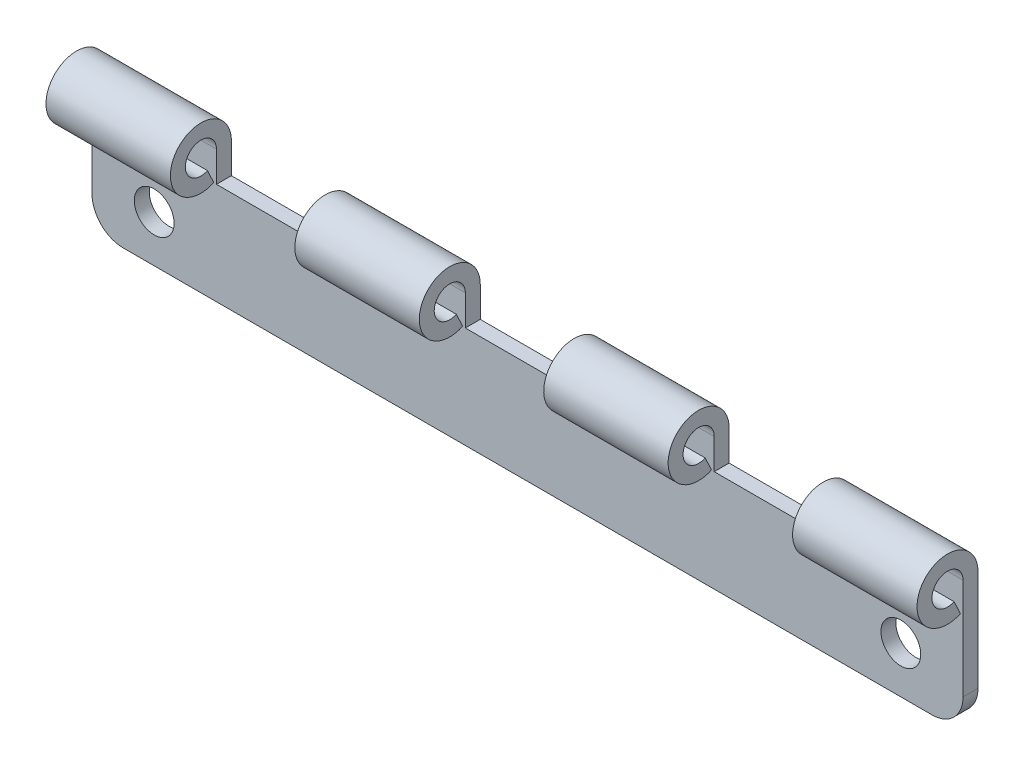
ISO-10303-21;
HEADER;
FILE_DESCRIPTION(('STEP AP214'),'2;1');
FILE_NAME('part.step','',(''),(''),'','','');
FILE_SCHEMA(('AUTOMOTIVE_DESIGN { 1 0 10303 214 1 1 1 1 }'));
ENDSEC;
DATA;
#1=APPLICATION_CONTEXT('core data for automotive mechanical design processes');
#2=APPLICATION_PROTOCOL_DEFINITION('international standard','automotive_design',2000,#1);
#3=PRODUCT_CONTEXT('',#1,'mechanical');
#4=PRODUCT('Part','Part','',(#3));
#5=PRODUCT_RELATED_PRODUCT_CATEGORY('part','',(#4));
#6=PRODUCT_DEFINITION_FORMATION('','',#4);
#7=PRODUCT_DEFINITION_CONTEXT('part definition',#1,'design');
#8=PRODUCT_DEFINITION('design','',#6,#7);
#9=PRODUCT_DEFINITION_SHAPE('','',#8);
#10=(LENGTH_UNIT() NAMED_UNIT(*) SI_UNIT(.MILLI.,.METRE.));
#11=(NAMED_UNIT(*) PLANE_ANGLE_UNIT() SI_UNIT($,.RADIAN.));
#12=(NAMED_UNIT(*) SI_UNIT($,.STERADIAN.) SOLID_ANGLE_UNIT());
#13=UNCERTAINTY_MEASURE_WITH_UNIT(LENGTH_MEASURE(1.E-05),#10,'distance_accuracy_value','');
#14=(GEOMETRIC_REPRESENTATION_CONTEXT(3) GLOBAL_UNCERTAINTY_ASSIGNED_CONTEXT((#13)) GLOBAL_UNIT_ASSIGNED_CONTEXT((#10,
#11,#12)) REPRESENTATION_CONTEXT('',''));
#15=CARTESIAN_POINT('',(0.,0.,0.));
#16=DIRECTION('',(0.,0.,1.));
#17=DIRECTION('',(1.,0.,0.));
#18=AXIS2_PLACEMENT_3D('',#15,#16,#17);
#19=CARTESIAN_POINT('',(304.8,0.,0.));
#20=DIRECTION('',(-1.,0.,0.));
#21=DIRECTION('',(0.,0.,1.));
#22=AXIS2_PLACEMENT_3D('',#19,#20,#21);
#23=CYLINDRICAL_SURFACE('',#22,3.1115);
#24=DIRECTION('',(-1.,0.,0.));
#25=VECTOR('',#24,1.);
#26=CARTESIAN_POINT('',(304.8,-2.81997667936453,-1.31497672140619));
#27=LINE('',#26,#25);
#28=CARTESIAN_POINT('',(-215.9,-2.81997667936453,-1.31497672140619));
#29=VERTEX_POINT('',#28);
#30=CARTESIAN_POINT('',(-228.6,-2.81997667936453,-1.31497672140619));
#31=VERTEX_POINT('',#30);
#32=EDGE_CURVE('E432',#29,#31,#27,.T.);
#33=ORIENTED_EDGE('',*,*,#32,.F.);
#34=CARTESIAN_POINT('',(-215.9,0.,0.));
#35=DIRECTION('',(-1.,0.,0.));
#36=DIRECTION('',(0.,0.,1.));
#37=AXIS2_PLACEMENT_3D('',#34,#35,#36);
#38=CIRCLE('',#37,3.1115);
#39=CARTESIAN_POINT('',(-215.9,0.,-3.1115));
#40=VERTEX_POINT('',#39);
#41=EDGE_CURVE('E402',#29,#40,#38,.T.);
#42=ORIENTED_EDGE('',*,*,#41,.T.);
#43=DIRECTION('',(-1.,0.,0.));
#44=VECTOR('',#43,1.);
#45=CARTESIAN_POINT('',(304.8,0.,-3.1115));
#46=LINE('',#45,#44);
#47=CARTESIAN_POINT('',(-228.6,0.,-3.1115));
#48=VERTEX_POINT('',#47);
#49=EDGE_CURVE('E438',#40,#48,#46,.T.);
#50=ORIENTED_EDGE('',*,*,#49,.T.);
#51=CARTESIAN_POINT('',(-228.6,0.,0.));
#52=DIRECTION('',(1.,0.,0.));
#53=DIRECTION('',(0.,0.,-1.));
#54=AXIS2_PLACEMENT_3D('',#51,#52,#53);
#55=CIRCLE('',#54,3.1115);
#56=EDGE_CURVE('E275',#48,#31,#55,.T.);
#57=ORIENTED_EDGE('',*,*,#56,.T.);
#58=EDGE_LOOP('',(#33,#42,#50,#57));
#59=FACE_BOUND('',#58,.T.);
#60=ADVANCED_FACE('F49',(#59),#23,.T.);
#61=CARTESIAN_POINT('',(-241.3,-2.81997667936453,-1.31497672140619));
#62=VERTEX_POINT('',#61);
#63=CARTESIAN_POINT('',(-254.,-2.81997667936453,-1.31497672140619));
#64=VERTEX_POINT('',#63);
#65=EDGE_CURVE('E599',#62,#64,#27,.T.);
#66=ORIENTED_EDGE('',*,*,#65,.F.);
#67=CARTESIAN_POINT('',(-241.3,0.,0.));
#68=DIRECTION('',(-1.,0.,0.));
#69=DIRECTION('',(0.,0.,1.));
#70=AXIS2_PLACEMENT_3D('',#67,#68,#69);
#71=CIRCLE('',#70,3.1115);
#72=CARTESIAN_POINT('',(-241.3,0.,-3.1115));
#73=VERTEX_POINT('',#72);
#74=EDGE_CURVE('E393',#62,#73,#71,.T.);
#75=ORIENTED_EDGE('',*,*,#74,.T.);
#76=CARTESIAN_POINT('',(-254.,0.,-3.1115));
#77=VERTEX_POINT('',#76);
#78=EDGE_CURVE('E581',#73,#77,#46,.T.);
#79=ORIENTED_EDGE('',*,*,#78,.T.);
#80=CARTESIAN_POINT('',(-254.,0.,0.));
#81=DIRECTION('',(1.,0.,0.));
#82=DIRECTION('',(0.,0.,-1.));
#83=AXIS2_PLACEMENT_3D('',#80,#81,#82);
#84=CIRCLE('',#83,3.1115);
#85=EDGE_CURVE('E362',#77,#64,#84,.T.);
#86=ORIENTED_EDGE('',*,*,#85,.T.);
#87=EDGE_LOOP('',(#66,#75,#79,#86));
#88=FACE_BOUND('',#87,.T.);
#89=ADVANCED_FACE('F528',(#88),#23,.T.);
#90=CARTESIAN_POINT('',(-266.7,-2.81997667936453,-1.31497672140619));
#91=VERTEX_POINT('',#90);
#92=CARTESIAN_POINT('',(-279.4,-2.81997667936453,-1.31497672140619));
#93=VERTEX_POINT('',#92);
#94=EDGE_CURVE('E431',#91,#93,#27,.T.);
#95=ORIENTED_EDGE('',*,*,#94,.F.);
#96=CARTESIAN_POINT('',(-266.7,0.,0.));
#97=DIRECTION('',(-1.,0.,0.));
#98=DIRECTION('',(0.,0.,1.));
#99=AXIS2_PLACEMENT_3D('',#96,#97,#98);
#100=CIRCLE('',#99,3.1115);
#101=CARTESIAN_POINT('',(-266.7,0.,-3.1115));
#102=VERTEX_POINT('',#101);
#103=EDGE_CURVE('E373',#91,#102,#100,.T.);
#104=ORIENTED_EDGE('',*,*,#103,.T.);
#105=CARTESIAN_POINT('',(-279.4,0.,-3.1115));
#106=VERTEX_POINT('',#105);
#107=EDGE_CURVE('E437',#102,#106,#46,.T.);
#108=ORIENTED_EDGE('',*,*,#107,.T.);
#109=CARTESIAN_POINT('',(-279.4,0.,0.));
#110=DIRECTION('',(1.,0.,0.));
#111=DIRECTION('',(0.,0.,-1.));
#112=AXIS2_PLACEMENT_3D('',#109,#110,#111);
#113=CIRCLE('',#112,3.1115);
#114=EDGE_CURVE('E341',#106,#93,#113,.T.);
#115=ORIENTED_EDGE('',*,*,#114,.T.);
#116=EDGE_LOOP('',(#95,#104,#108,#115));
#117=FACE_BOUND('',#116,.T.);
#118=ADVANCED_FACE('F534',(#117),#23,.T.);
#119=CARTESIAN_POINT('',(-292.1,-2.81997667936453,-1.31497672140619));
#120=VERTEX_POINT('',#119);
#121=CARTESIAN_POINT('',(-304.8,-2.81997667936453,-1.31497672140619));
#122=VERTEX_POINT('',#121);
#123=EDGE_CURVE('E428',#120,#122,#27,.T.);
#124=ORIENTED_EDGE('',*,*,#123,.F.);
#125=CARTESIAN_POINT('',(-292.1,0.,0.));
#126=DIRECTION('',(-1.,0.,0.));
#127=DIRECTION('',(0.,0.,1.));
#128=AXIS2_PLACEMENT_3D('',#125,#126,#127);
#129=CIRCLE('',#128,3.1115);
#130=CARTESIAN_POINT('',(-292.1,0.,-3.1115));
#131=VERTEX_POINT('',#130);
#132=EDGE_CURVE('E352',#120,#131,#129,.T.);
#133=ORIENTED_EDGE('',*,*,#132,.T.);
#134=CARTESIAN_POINT('',(-304.8,0.,-3.1115));
#135=VERTEX_POINT('',#134);
#136=EDGE_CURVE('E433',#131,#135,#46,.T.);
#137=ORIENTED_EDGE('',*,*,#136,.T.);
#138=CARTESIAN_POINT('',(-304.8,0.,0.));
#139=DIRECTION('',(1.,0.,0.));
#140=DIRECTION('',(0.,0.,-1.));
#141=AXIS2_PLACEMENT_3D('',#138,#139,#140);
#142=CIRCLE('',#141,3.1115);
#143=EDGE_CURVE('E406',#135,#122,#142,.T.);
#144=ORIENTED_EDGE('',*,*,#143,.T.);
#145=EDGE_LOOP('',(#124,#133,#137,#144));
#146=FACE_BOUND('',#145,.T.);
#147=ADVANCED_FACE('F530',(#146),#23,.T.);
#148=CARTESIAN_POINT('',(304.8,-1.43876361192068,-0.670906490513363));
#149=DIRECTION('',(0.,-0.422618261740701,0.906307787036649));
#150=DIRECTION('',(0.,-0.906307787036649,-0.422618261740701));
#151=AXIS2_PLACEMENT_3D('',#148,#149,#150);
#152=PLANE('',#151);
#153=DIRECTION('',(-1.,0.,0.));
#154=VECTOR('',#153,1.);
#155=CARTESIAN_POINT('',(304.8,-1.43876361192068,-0.670906490513362));
#156=LINE('',#155,#154);
#157=CARTESIAN_POINT('',(-215.9,-1.43876361192068,-0.670906490513362));
#158=VERTEX_POINT('',#157);
#159=CARTESIAN_POINT('',(-228.6,-1.43876361192068,-0.670906490513362));
#160=VERTEX_POINT('',#159);
#161=EDGE_CURVE('E427',#158,#160,#156,.T.);
#162=ORIENTED_EDGE('',*,*,#161,.F.);
#163=DIRECTION('',(0.,-0.906307787036649,-0.422618261740701));
#164=VECTOR('',#163,1.);
#165=CARTESIAN_POINT('',(-215.9,-1.43876361192068,-0.670906490513363));
#166=LINE('',#165,#164);
#167=EDGE_CURVE('E399',#158,#29,#166,.T.);
#168=ORIENTED_EDGE('',*,*,#167,.T.);
#169=ORIENTED_EDGE('',*,*,#32,.T.);
#170=DIRECTION('',(0.,0.906307787036649,0.422618261740701));
#171=VECTOR('',#170,1.);
#172=CARTESIAN_POINT('',(-228.6,-1.43876361192068,-0.670906490513363));
#173=LINE('',#172,#171);
#174=EDGE_CURVE('E380',#31,#160,#173,.T.);
#175=ORIENTED_EDGE('',*,*,#174,.T.);
#176=EDGE_LOOP('',(#162,#168,#169,#175));
#177=FACE_BOUND('',#176,.T.);
#178=ADVANCED_FACE('F539',(#177),#152,.F.);
#179=CARTESIAN_POINT('',(-241.3,-1.43876361192068,-0.670906490513362));
#180=VERTEX_POINT('',#179);
#181=CARTESIAN_POINT('',(-254.,-1.43876361192068,-0.670906490513362));
#182=VERTEX_POINT('',#181);
#183=EDGE_CURVE('E623',#180,#182,#156,.T.);
#184=ORIENTED_EDGE('',*,*,#183,.F.);
#185=DIRECTION('',(0.,-0.906307787036649,-0.422618261740701));
#186=VECTOR('',#185,1.);
#187=CARTESIAN_POINT('',(-241.3,-1.43876361192068,-0.670906490513363));
#188=LINE('',#187,#186);
#189=EDGE_CURVE('E389',#180,#62,#188,.T.);
#190=ORIENTED_EDGE('',*,*,#189,.T.);
#191=ORIENTED_EDGE('',*,*,#65,.T.);
#192=DIRECTION('',(0.,0.906307787036649,0.422618261740701));
#193=VECTOR('',#192,1.);
#194=CARTESIAN_POINT('',(-254.,-1.43876361192068,-0.670906490513363));
#195=LINE('',#194,#193);
#196=EDGE_CURVE('E359',#64,#182,#195,.T.);
#197=ORIENTED_EDGE('',*,*,#196,.T.);
#198=EDGE_LOOP('',(#184,#190,#191,#197));
#199=FACE_BOUND('',#198,.T.);
#200=ADVANCED_FACE('F545',(#199),#152,.F.);
#201=CARTESIAN_POINT('',(-266.7,-1.43876361192068,-0.670906490513362));
#202=VERTEX_POINT('',#201);
#203=CARTESIAN_POINT('',(-279.4,-1.43876361192068,-0.670906490513362));
#204=VERTEX_POINT('',#203);
#205=EDGE_CURVE('E426',#202,#204,#156,.T.);
#206=ORIENTED_EDGE('',*,*,#205,.F.);
#207=DIRECTION('',(0.,-0.906307787036649,-0.422618261740701));
#208=VECTOR('',#207,1.);
#209=CARTESIAN_POINT('',(-266.7,-1.43876361192068,-0.670906490513363));
#210=LINE('',#209,#208);
#211=EDGE_CURVE('E369',#202,#91,#210,.T.);
#212=ORIENTED_EDGE('',*,*,#211,.T.);
#213=ORIENTED_EDGE('',*,*,#94,.T.);
#214=DIRECTION('',(0.,0.906307787036649,0.422618261740701));
#215=VECTOR('',#214,1.);
#216=CARTESIAN_POINT('',(-279.4,-1.43876361192068,-0.670906490513363));
#217=LINE('',#216,#215);
#218=EDGE_CURVE('E337',#93,#204,#217,.T.);
#219=ORIENTED_EDGE('',*,*,#218,.T.);
#220=EDGE_LOOP('',(#206,#212,#213,#219));
#221=FACE_BOUND('',#220,.T.);
#222=ADVANCED_FACE('F597',(#221),#152,.F.);
#223=CARTESIAN_POINT('',(-292.1,-1.43876361192068,-0.670906490513362));
#224=VERTEX_POINT('',#223);
#225=CARTESIAN_POINT('',(-304.8,-1.43876361192068,-0.670906490513362));
#226=VERTEX_POINT('',#225);
#227=EDGE_CURVE('E423',#224,#226,#156,.T.);
#228=ORIENTED_EDGE('',*,*,#227,.F.);
#229=DIRECTION('',(0.,-0.906307787036649,-0.422618261740701));
#230=VECTOR('',#229,1.);
#231=CARTESIAN_POINT('',(-292.1,-1.43876361192068,-0.670906490513363));
#232=LINE('',#231,#230);
#233=EDGE_CURVE('E348',#224,#120,#232,.T.);
#234=ORIENTED_EDGE('',*,*,#233,.T.);
#235=ORIENTED_EDGE('',*,*,#123,.T.);
#236=DIRECTION('',(0.,0.906307787036649,0.422618261740701));
#237=VECTOR('',#236,1.);
#238=CARTESIAN_POINT('',(-304.8,-1.43876361192068,-0.670906490513363));
#239=LINE('',#238,#237);
#240=EDGE_CURVE('E410',#122,#226,#239,.T.);
#241=ORIENTED_EDGE('',*,*,#240,.T.);
#242=EDGE_LOOP('',(#228,#234,#235,#241));
#243=FACE_BOUND('',#242,.T.);
#244=ADVANCED_FACE('F547',(#243),#152,.F.);
#245=CARTESIAN_POINT('',(304.8,0.,0.));
#246=DIRECTION('',(-1.,0.,0.));
#247=DIRECTION('',(0.,0.,1.));
#248=AXIS2_PLACEMENT_3D('',#245,#246,#247);
#249=CYLINDRICAL_SURFACE('',#248,1.5875);
#250=DIRECTION('',(-1.,0.,0.));
#251=VECTOR('',#250,1.);
#252=CARTESIAN_POINT('',(304.8,0.,-1.5875));
#253=LINE('',#252,#251);
#254=CARTESIAN_POINT('',(-215.9,0.,-1.5875));
#255=VERTEX_POINT('',#254);
#256=CARTESIAN_POINT('',(-228.6,0.,-1.5875));
#257=VERTEX_POINT('',#256);
#258=EDGE_CURVE('E422',#255,#257,#253,.T.);
#259=ORIENTED_EDGE('',*,*,#258,.F.);
#260=CARTESIAN_POINT('',(-215.9,0.,0.));
#261=DIRECTION('',(-1.,0.,0.));
#262=DIRECTION('',(0.,0.,1.));
#263=AXIS2_PLACEMENT_3D('',#260,#261,#262);
#264=CIRCLE('',#263,1.5875);
#265=EDGE_CURVE('E396',#255,#158,#264,.F.);
#266=ORIENTED_EDGE('',*,*,#265,.T.);
#267=ORIENTED_EDGE('',*,*,#161,.T.);
#268=CARTESIAN_POINT('',(-228.6,0.,0.));
#269=DIRECTION('',(1.,0.,0.));
#270=DIRECTION('',(0.,0.,-1.));
#271=AXIS2_PLACEMENT_3D('',#268,#269,#270);
#272=CIRCLE('',#271,1.5875);
#273=EDGE_CURVE('E376',#160,#257,#272,.F.);
#274=ORIENTED_EDGE('',*,*,#273,.T.);
#275=EDGE_LOOP('',(#259,#266,#267,#274));
#276=FACE_BOUND('',#275,.T.);
#277=ADVANCED_FACE('F613',(#276),#249,.F.);
#278=CARTESIAN_POINT('',(-241.3,0.,-1.5875));
#279=VERTEX_POINT('',#278);
#280=CARTESIAN_POINT('',(-254.,0.,-1.5875));
#281=VERTEX_POINT('',#280);
#282=EDGE_CURVE('E615',#279,#281,#253,.T.);
#283=ORIENTED_EDGE('',*,*,#282,.F.);
#284=CARTESIAN_POINT('',(-241.3,0.,0.));
#285=DIRECTION('',(-1.,0.,0.));
#286=DIRECTION('',(0.,0.,1.));
#287=AXIS2_PLACEMENT_3D('',#284,#285,#286);
#288=CIRCLE('',#287,1.5875);
#289=EDGE_CURVE('E385',#279,#180,#288,.F.);
#290=ORIENTED_EDGE('',*,*,#289,.T.);
#291=ORIENTED_EDGE('',*,*,#183,.T.);
#292=CARTESIAN_POINT('',(-254.,0.,0.));
#293=DIRECTION('',(1.,0.,0.));
#294=DIRECTION('',(0.,0.,-1.));
#295=AXIS2_PLACEMENT_3D('',#292,#293,#294);
#296=CIRCLE('',#295,1.5875);
#297=EDGE_CURVE('E355',#182,#281,#296,.F.);
#298=ORIENTED_EDGE('',*,*,#297,.T.);
#299=EDGE_LOOP('',(#283,#290,#291,#298));
#300=FACE_BOUND('',#299,.T.);
#301=ADVANCED_FACE('F628',(#300),#249,.F.);
#302=CARTESIAN_POINT('',(-266.7,0.,-1.5875));
#303=VERTEX_POINT('',#302);
#304=CARTESIAN_POINT('',(-279.4,0.,-1.5875));
#305=VERTEX_POINT('',#304);
#306=EDGE_CURVE('E421',#303,#305,#253,.T.);
#307=ORIENTED_EDGE('',*,*,#306,.F.);
#308=CARTESIAN_POINT('',(-266.7,0.,0.));
#309=DIRECTION('',(-1.,0.,0.));
#310=DIRECTION('',(0.,0.,1.));
#311=AXIS2_PLACEMENT_3D('',#308,#309,#310);
#312=CIRCLE('',#311,1.5875);
#313=EDGE_CURVE('E365',#303,#202,#312,.F.);
#314=ORIENTED_EDGE('',*,*,#313,.T.);
#315=ORIENTED_EDGE('',*,*,#205,.T.);
#316=CARTESIAN_POINT('',(-279.4,0.,0.));
#317=DIRECTION('',(1.,0.,0.));
#318=DIRECTION('',(0.,0.,-1.));
#319=AXIS2_PLACEMENT_3D('',#316,#317,#318);
#320=CIRCLE('',#319,1.5875);
#321=EDGE_CURVE('E333',#204,#305,#320,.F.);
#322=ORIENTED_EDGE('',*,*,#321,.T.);
#323=EDGE_LOOP('',(#307,#314,#315,#322));
#324=FACE_BOUND('',#323,.T.);
#325=ADVANCED_FACE('F622',(#324),#249,.F.);
#326=CARTESIAN_POINT('',(-292.1,0.,-1.5875));
#327=VERTEX_POINT('',#326);
#328=CARTESIAN_POINT('',(-304.8,0.,-1.5875));
#329=VERTEX_POINT('',#328);
#330=EDGE_CURVE('E418',#327,#329,#253,.T.);
#331=ORIENTED_EDGE('',*,*,#330,.F.);
#332=CARTESIAN_POINT('',(-292.1,0.,0.));
#333=DIRECTION('',(-1.,0.,0.));
#334=DIRECTION('',(0.,0.,1.));
#335=AXIS2_PLACEMENT_3D('',#332,#333,#334);
#336=CIRCLE('',#335,1.5875);
#337=EDGE_CURVE('E344',#327,#224,#336,.F.);
#338=ORIENTED_EDGE('',*,*,#337,.T.);
#339=ORIENTED_EDGE('',*,*,#227,.T.);
#340=CARTESIAN_POINT('',(-304.8,0.,0.));
#341=DIRECTION('',(-1.,0.,0.));
#342=DIRECTION('',(0.,0.,-1.));
#343=AXIS2_PLACEMENT_3D('',#340,#341,#342);
#344=CIRCLE('',#343,1.5875);
#345=EDGE_CURVE('E413',#226,#329,#344,.T.);
#346=ORIENTED_EDGE('',*,*,#345,.T.);
#347=EDGE_LOOP('',(#331,#338,#339,#346));
#348=FACE_BOUND('',#347,.T.);
#349=ADVANCED_FACE('F523',(#348),#249,.F.);
#350=CARTESIAN_POINT('',(304.8,-13.49375,-3.1115));
#351=DIRECTION('',(0.,1.,0.));
#352=DIRECTION('',(0.,0.,1.));
#353=AXIS2_PLACEMENT_3D('',#350,#351,#352);
#354=PLANE('',#353);
#355=DIRECTION('',(-1.,0.,0.));
#356=VECTOR('',#355,1.);
#357=CARTESIAN_POINT('',(304.8,-13.49375,-1.5875));
#358=LINE('',#357,#356);
#359=CARTESIAN_POINT('',(-219.075,-13.49375,-1.5875));
#360=VERTEX_POINT('',#359);
#361=CARTESIAN_POINT('',(-301.625,-13.49375,-1.5875));
#362=VERTEX_POINT('',#361);
#363=EDGE_CURVE('E442',#360,#362,#358,.T.);
#364=ORIENTED_EDGE('',*,*,#363,.T.);
#365=DIRECTION('',(0.,0.,-1.));
#366=VECTOR('',#365,1.);
#367=CARTESIAN_POINT('',(-301.625,-13.49375,-3.1115));
#368=LINE('',#367,#366);
#369=CARTESIAN_POINT('',(-301.625,-13.49375,-3.1115));
#370=VERTEX_POINT('',#369);
#371=EDGE_CURVE('E484',#362,#370,#368,.T.);
#372=ORIENTED_EDGE('',*,*,#371,.T.);
#373=DIRECTION('',(-1.,0.,0.));
#374=VECTOR('',#373,1.);
#375=CARTESIAN_POINT('',(304.8,-13.49375,-3.1115));
#376=LINE('',#375,#374);
#377=CARTESIAN_POINT('',(-219.075,-13.49375,-3.1115));
#378=VERTEX_POINT('',#377);
#379=EDGE_CURVE('E439',#378,#370,#376,.T.);
#380=ORIENTED_EDGE('',*,*,#379,.F.);
#381=DIRECTION('',(0.,0.,1.));
#382=VECTOR('',#381,1.);
#383=CARTESIAN_POINT('',(-219.075,-13.49375,-3.1115));
#384=LINE('',#383,#382);
#385=EDGE_CURVE('E481',#378,#360,#384,.T.);
#386=ORIENTED_EDGE('',*,*,#385,.T.);
#387=EDGE_LOOP('',(#364,#372,#380,#386));
#388=FACE_BOUND('',#387,.T.);
#389=ADVANCED_FACE('F512',(#388),#354,.F.);
#390=CARTESIAN_POINT('',(304.8,0.,-3.1115));
#391=DIRECTION('',(0.,0.,1.));
#392=DIRECTION('',(0.,-1.,0.));
#393=AXIS2_PLACEMENT_3D('',#390,#391,#392);
#394=PLANE('',#393);
#395=CARTESIAN_POINT('',(-222.25,-8.73125,-3.1115));
#396=DIRECTION('',(0.,0.,-1.));
#397=DIRECTION('',(0.,1.,0.));
#398=AXIS2_PLACEMENT_3D('',#395,#396,#397);
#399=CIRCLE('',#398,2.03200000000001);
#400=CARTESIAN_POINT('',(-222.25,-6.69924999999999,-3.1115));
#401=VERTEX_POINT('',#400);
#402=EDGE_CURVE('E495',#401,#401,#399,.T.);
#403=ORIENTED_EDGE('',*,*,#402,.F.);
#404=EDGE_LOOP('',(#403));
#405=FACE_BOUND('',#404,.T.);
#406=CARTESIAN_POINT('',(-298.45,-8.73125,-3.1115));
#407=DIRECTION('',(0.,0.,-1.));
#408=DIRECTION('',(0.,1.,0.));
#409=AXIS2_PLACEMENT_3D('',#406,#407,#408);
#410=CIRCLE('',#409,2.03199999999995);
#411=CARTESIAN_POINT('',(-298.45,-6.69925000000005,-3.1115));
#412=VERTEX_POINT('',#411);
#413=EDGE_CURVE('E500',#412,#412,#410,.T.);
#414=ORIENTED_EDGE('',*,*,#413,.F.);
#415=EDGE_LOOP('',(#414));
#416=FACE_BOUND('',#415,.T.);
#417=ORIENTED_EDGE('',*,*,#379,.T.);
#418=CARTESIAN_POINT('',(-301.625,-10.31875,-3.1115));
#419=DIRECTION('',(0.,0.,1.));
#420=DIRECTION('',(0.,-1.,0.));
#421=AXIS2_PLACEMENT_3D('',#418,#419,#420);
#422=CIRCLE('',#421,3.175);
#423=CARTESIAN_POINT('',(-304.8,-10.31875,-3.1115));
#424=VERTEX_POINT('',#423);
#425=EDGE_CURVE('E489',#370,#424,#422,.F.);
#426=ORIENTED_EDGE('',*,*,#425,.T.);
#427=DIRECTION('',(0.,1.,0.));
#428=VECTOR('',#427,1.);
#429=CARTESIAN_POINT('',(-304.8,0.,-3.1115));
#430=LINE('',#429,#428);
#431=EDGE_CURVE('E404',#424,#135,#430,.T.);
#432=ORIENTED_EDGE('',*,*,#431,.T.);
#433=ORIENTED_EDGE('',*,*,#136,.F.);
#434=DIRECTION('',(0.,-1.,0.));
#435=VECTOR('',#434,1.);
#436=CARTESIAN_POINT('',(-292.1,-3.1115,-3.1115));
#437=LINE('',#436,#435);
#438=CARTESIAN_POINT('',(-292.1,-3.1115,-3.1115));
#439=VERTEX_POINT('',#438);
#440=EDGE_CURVE('E323',#131,#439,#437,.T.);
#441=ORIENTED_EDGE('',*,*,#440,.T.);
#442=DIRECTION('',(1.,0.,0.));
#443=VECTOR('',#442,1.);
#444=CARTESIAN_POINT('',(-279.4,-3.1115,-3.1115));
#445=LINE('',#444,#443);
#446=CARTESIAN_POINT('',(-279.4,-3.1115,-3.1115));
#447=VERTEX_POINT('',#446);
#448=EDGE_CURVE('E315',#439,#447,#445,.T.);
#449=ORIENTED_EDGE('',*,*,#448,.T.);
#450=DIRECTION('',(0.,1.,0.));
#451=VECTOR('',#450,1.);
#452=CARTESIAN_POINT('',(-279.4,3.11150000000004,-3.1115));
#453=LINE('',#452,#451);
#454=EDGE_CURVE('E319',#447,#106,#453,.T.);
#455=ORIENTED_EDGE('',*,*,#454,.T.);
#456=ORIENTED_EDGE('',*,*,#107,.F.);
#457=DIRECTION('',(0.,-1.,0.));
#458=VECTOR('',#457,1.);
#459=CARTESIAN_POINT('',(-266.7,-3.1115,-3.1115));
#460=LINE('',#459,#458);
#461=CARTESIAN_POINT('',(-266.7,-3.1115,-3.1115));
#462=VERTEX_POINT('',#461);
#463=EDGE_CURVE('E310',#102,#462,#460,.T.);
#464=ORIENTED_EDGE('',*,*,#463,.T.);
#465=DIRECTION('',(1.,0.,0.));
#466=VECTOR('',#465,1.);
#467=CARTESIAN_POINT('',(-254.,-3.1115,-3.1115));
#468=LINE('',#467,#466);
#469=CARTESIAN_POINT('',(-254.,-3.1115,-3.1115));
#470=VERTEX_POINT('',#469);
#471=EDGE_CURVE('E301',#462,#470,#468,.T.);
#472=ORIENTED_EDGE('',*,*,#471,.T.);
#473=DIRECTION('',(0.,1.,0.));
#474=VECTOR('',#473,1.);
#475=CARTESIAN_POINT('',(-254.,3.11150000000004,-3.1115));
#476=LINE('',#475,#474);
#477=EDGE_CURVE('E305',#470,#77,#476,.T.);
#478=ORIENTED_EDGE('',*,*,#477,.T.);
#479=ORIENTED_EDGE('',*,*,#78,.F.);
#480=DIRECTION('',(0.,-1.,0.));
#481=VECTOR('',#480,1.);
#482=CARTESIAN_POINT('',(-241.3,-3.1115,-3.1115));
#483=LINE('',#482,#481);
#484=CARTESIAN_POINT('',(-241.3,-3.1115,-3.1115));
#485=VERTEX_POINT('',#484);
#486=EDGE_CURVE('E269',#73,#485,#483,.T.);
#487=ORIENTED_EDGE('',*,*,#486,.T.);
#488=DIRECTION('',(1.,0.,0.));
#489=VECTOR('',#488,1.);
#490=CARTESIAN_POINT('',(-228.6,-3.1115,-3.1115));
#491=LINE('',#490,#489);
#492=CARTESIAN_POINT('',(-228.6,-3.1115,-3.1115));
#493=VERTEX_POINT('',#492);
#494=EDGE_CURVE('E261',#485,#493,#491,.T.);
#495=ORIENTED_EDGE('',*,*,#494,.T.);
#496=DIRECTION('',(0.,1.,0.));
#497=VECTOR('',#496,1.);
#498=CARTESIAN_POINT('',(-228.6,3.11150000000004,-3.1115));
#499=LINE('',#498,#497);
#500=EDGE_CURVE('E272',#493,#48,#499,.T.);
#501=ORIENTED_EDGE('',*,*,#500,.T.);
#502=ORIENTED_EDGE('',*,*,#49,.F.);
#503=DIRECTION('',(0.,-1.,0.));
#504=VECTOR('',#503,1.);
#505=CARTESIAN_POINT('',(-215.9,-3.1115,-3.1115));
#506=LINE('',#505,#504);
#507=CARTESIAN_POINT('',(-215.9,-10.31875,-3.1115));
#508=VERTEX_POINT('',#507);
#509=EDGE_CURVE('E295',#40,#508,#506,.T.);
#510=ORIENTED_EDGE('',*,*,#509,.T.);
#511=CARTESIAN_POINT('',(-219.075,-10.31875,-3.1115));
#512=DIRECTION('',(0.,0.,1.));
#513=DIRECTION('',(0.,-1.,0.));
#514=AXIS2_PLACEMENT_3D('',#511,#512,#513);
#515=CIRCLE('',#514,3.175);
#516=EDGE_CURVE('E487',#508,#378,#515,.F.);
#517=ORIENTED_EDGE('',*,*,#516,.T.);
#518=EDGE_LOOP('',(#417,#426,#432,#433,#441,#449,#455,#456,#464,#472,#478,#479,#487,#495,#501,
#502,#510,#517));
#519=FACE_BOUND('',#518,.T.);
#520=ADVANCED_FACE('F282',(#405,#416,#519),#394,.F.);
#521=CARTESIAN_POINT('',(304.8,0.,-1.5875));
#522=DIRECTION('',(0.,0.,-1.));
#523=DIRECTION('',(0.,1.,0.));
#524=AXIS2_PLACEMENT_3D('',#521,#522,#523);
#525=PLANE('',#524);
#526=CARTESIAN_POINT('',(-222.25,-8.73125,-1.58750000000002));
#527=DIRECTION('',(0.,0.,-1.));
#528=DIRECTION('',(0.,1.,0.));
#529=AXIS2_PLACEMENT_3D('',#526,#527,#528);
#530=CIRCLE('',#529,2.03200000000001);
#531=CARTESIAN_POINT('',(-222.25,-6.69924999999999,-1.58750000000001));
#532=VERTEX_POINT('',#531);
#533=EDGE_CURVE('E53',#532,#532,#530,.T.);
#534=ORIENTED_EDGE('',*,*,#533,.T.);
#535=EDGE_LOOP('',(#534));
#536=FACE_BOUND('',#535,.T.);
#537=CARTESIAN_POINT('',(-298.45,-8.73125,-1.58750000000002));
#538=DIRECTION('',(0.,0.,-1.));
#539=DIRECTION('',(0.,1.,0.));
#540=AXIS2_PLACEMENT_3D('',#537,#538,#539);
#541=CIRCLE('',#540,2.03199999999995);
#542=CARTESIAN_POINT('',(-298.45,-6.69925000000005,-1.58750000000001));
#543=VERTEX_POINT('',#542);
#544=EDGE_CURVE('E493',#543,#543,#541,.T.);
#545=ORIENTED_EDGE('',*,*,#544,.T.);
#546=EDGE_LOOP('',(#545));
#547=FACE_BOUND('',#546,.T.);
#548=DIRECTION('',(0.,-1.,0.));
#549=VECTOR('',#548,1.);
#550=CARTESIAN_POINT('',(-304.8,0.,-1.5875));
#551=LINE('',#550,#549);
#552=CARTESIAN_POINT('',(-304.8,-10.31875,-1.58750000000002));
#553=VERTEX_POINT('',#552);
#554=EDGE_CURVE('E416',#329,#553,#551,.T.);
#555=ORIENTED_EDGE('',*,*,#554,.T.);
#556=CARTESIAN_POINT('',(-301.625,-10.31875,-1.58750000000002));
#557=DIRECTION('',(0.,0.,-1.));
#558=DIRECTION('',(0.,1.,0.));
#559=AXIS2_PLACEMENT_3D('',#556,#557,#558);
#560=CIRCLE('',#559,3.175);
#561=EDGE_CURVE('E58',#553,#362,#560,.F.);
#562=ORIENTED_EDGE('',*,*,#561,.T.);
#563=ORIENTED_EDGE('',*,*,#363,.F.);
#564=CARTESIAN_POINT('',(-219.075,-10.31875,-1.58750000000002));
#565=DIRECTION('',(0.,0.,-1.));
#566=DIRECTION('',(0.,1.,0.));
#567=AXIS2_PLACEMENT_3D('',#564,#565,#566);
#568=CIRCLE('',#567,3.175);
#569=CARTESIAN_POINT('',(-215.9,-10.31875,-1.58750000000002));
#570=VERTEX_POINT('',#569);
#571=EDGE_CURVE('E66',#360,#570,#568,.F.);
#572=ORIENTED_EDGE('',*,*,#571,.T.);
#573=DIRECTION('',(0.,1.,0.));
#574=VECTOR('',#573,1.);
#575=CARTESIAN_POINT('',(-215.9,0.,-1.5875));
#576=LINE('',#575,#574);
#577=EDGE_CURVE('E479',#570,#255,#576,.T.);
#578=ORIENTED_EDGE('',*,*,#577,.T.);
#579=ORIENTED_EDGE('',*,*,#258,.T.);
#580=DIRECTION('',(0.,-1.,0.));
#581=VECTOR('',#580,1.);
#582=CARTESIAN_POINT('',(-228.6,0.,-1.5875));
#583=LINE('',#582,#581);
#584=CARTESIAN_POINT('',(-228.6,-3.1115,-1.58750000000001));
#585=VERTEX_POINT('',#584);
#586=EDGE_CURVE('E470',#257,#585,#583,.T.);
#587=ORIENTED_EDGE('',*,*,#586,.T.);
#588=DIRECTION('',(-1.,0.,0.));
#589=VECTOR('',#588,1.);
#590=CARTESIAN_POINT('',(304.8,-3.11149999999998,-1.58750000000001));
#591=LINE('',#590,#589);
#592=CARTESIAN_POINT('',(-241.3,-3.1115,-1.5875));
#593=VERTEX_POINT('',#592);
#594=EDGE_CURVE('E264',#585,#593,#591,.T.);
#595=ORIENTED_EDGE('',*,*,#594,.T.);
#596=DIRECTION('',(0.,1.,0.));
#597=VECTOR('',#596,1.);
#598=CARTESIAN_POINT('',(-241.3,0.,-1.5875));
#599=LINE('',#598,#597);
#600=EDGE_CURVE('E475',#593,#279,#599,.T.);
#601=ORIENTED_EDGE('',*,*,#600,.T.);
#602=ORIENTED_EDGE('',*,*,#282,.T.);
#603=DIRECTION('',(0.,-1.,0.));
#604=VECTOR('',#603,1.);
#605=CARTESIAN_POINT('',(-254.,0.,-1.5875));
#606=LINE('',#605,#604);
#607=CARTESIAN_POINT('',(-254.,-3.1115,-1.58750000000001));
#608=VERTEX_POINT('',#607);
#609=EDGE_CURVE('E458',#281,#608,#606,.T.);
#610=ORIENTED_EDGE('',*,*,#609,.T.);
#611=DIRECTION('',(-1.,0.,0.));
#612=VECTOR('',#611,1.);
#613=CARTESIAN_POINT('',(304.8,-3.11149999999998,-1.58750000000001));
#614=LINE('',#613,#612);
#615=CARTESIAN_POINT('',(-266.7,-3.1115,-1.5875));
#616=VERTEX_POINT('',#615);
#617=EDGE_CURVE('E462',#608,#616,#614,.T.);
#618=ORIENTED_EDGE('',*,*,#617,.T.);
#619=DIRECTION('',(0.,1.,0.));
#620=VECTOR('',#619,1.);
#621=CARTESIAN_POINT('',(-266.7,0.,-1.5875));
#622=LINE('',#621,#620);
#623=EDGE_CURVE('E466',#616,#303,#622,.T.);
#624=ORIENTED_EDGE('',*,*,#623,.T.);
#625=ORIENTED_EDGE('',*,*,#306,.T.);
#626=DIRECTION('',(0.,-1.,0.));
#627=VECTOR('',#626,1.);
#628=CARTESIAN_POINT('',(-279.4,0.,-1.5875));
#629=LINE('',#628,#627);
#630=CARTESIAN_POINT('',(-279.4,-3.1115,-1.58750000000001));
#631=VERTEX_POINT('',#630);
#632=EDGE_CURVE('E446',#305,#631,#629,.T.);
#633=ORIENTED_EDGE('',*,*,#632,.T.);
#634=DIRECTION('',(-1.,0.,0.));
#635=VECTOR('',#634,1.);
#636=CARTESIAN_POINT('',(304.8,-3.11149999999998,-1.58750000000001));
#637=LINE('',#636,#635);
#638=CARTESIAN_POINT('',(-292.1,-3.1115,-1.5875));
#639=VERTEX_POINT('',#638);
#640=EDGE_CURVE('E450',#631,#639,#637,.T.);
#641=ORIENTED_EDGE('',*,*,#640,.T.);
#642=DIRECTION('',(0.,1.,0.));
#643=VECTOR('',#642,1.);
#644=CARTESIAN_POINT('',(-292.1,0.,-1.5875));
#645=LINE('',#644,#643);
#646=EDGE_CURVE('E454',#639,#327,#645,.T.);
#647=ORIENTED_EDGE('',*,*,#646,.T.);
#648=ORIENTED_EDGE('',*,*,#330,.T.);
#649=EDGE_LOOP('',(#555,#562,#563,#572,#578,#579,#587,#595,#601,#602,#610,#618,#624,#625,#633,
#641,#647,#648));
#650=FACE_BOUND('',#649,.T.);
#651=ADVANCED_FACE('F511',(#536,#547,#650),#525,.F.);
#652=CARTESIAN_POINT('',(-304.8,0.,0.));
#653=DIRECTION('',(1.,0.,0.));
#654=DIRECTION('',(0.,0.,-1.));
#655=AXIS2_PLACEMENT_3D('',#652,#653,#654);
#656=PLANE('',#655);
#657=ORIENTED_EDGE('',*,*,#431,.F.);
#658=DIRECTION('',(0.,0.,-1.));
#659=VECTOR('',#658,1.);
#660=CARTESIAN_POINT('',(-304.8,-10.31875,0.));
#661=LINE('',#660,#659);
#662=EDGE_CURVE('E74',#424,#553,#661,.F.);
#663=ORIENTED_EDGE('',*,*,#662,.T.);
#664=ORIENTED_EDGE('',*,*,#554,.F.);
#665=ORIENTED_EDGE('',*,*,#345,.F.);
#666=ORIENTED_EDGE('',*,*,#240,.F.);
#667=ORIENTED_EDGE('',*,*,#143,.F.);
#668=EDGE_LOOP('',(#657,#663,#664,#665,#666,#667));
#669=FACE_BOUND('',#668,.T.);
#670=ADVANCED_FACE('F519',(#669),#656,.F.);
#671=CARTESIAN_POINT('',(-279.4,-3.1115,-3.1115));
#672=DIRECTION('',(0.,-1.,0.));
#673=DIRECTION('',(1.,0.,0.));
#674=AXIS2_PLACEMENT_3D('',#671,#672,#673);
#675=PLANE('',#674);
#676=DIRECTION('',(0.,0.,1.));
#677=VECTOR('',#676,1.);
#678=CARTESIAN_POINT('',(-279.4,-3.1115,-3.1115));
#679=LINE('',#678,#677);
#680=EDGE_CURVE('E327',#447,#631,#679,.T.);
#681=ORIENTED_EDGE('',*,*,#680,.F.);
#682=ORIENTED_EDGE('',*,*,#448,.F.);
#683=DIRECTION('',(0.,0.,1.));
#684=VECTOR('',#683,1.);
#685=CARTESIAN_POINT('',(-292.1,-3.1115,-3.1115));
#686=LINE('',#685,#684);
#687=EDGE_CURVE('E306',#439,#639,#686,.T.);
#688=ORIENTED_EDGE('',*,*,#687,.T.);
#689=ORIENTED_EDGE('',*,*,#640,.F.);
#690=EDGE_LOOP('',(#681,#682,#688,#689));
#691=FACE_BOUND('',#690,.T.);
#692=ADVANCED_FACE('F564',(#691),#675,.F.);
#693=CARTESIAN_POINT('',(-292.1,-3.1115,-3.1115));
#694=DIRECTION('',(-1.,0.,0.));
#695=DIRECTION('',(0.,0.,1.));
#696=AXIS2_PLACEMENT_3D('',#693,#694,#695);
#697=PLANE('',#696);
#698=ORIENTED_EDGE('',*,*,#132,.F.);
#699=ORIENTED_EDGE('',*,*,#233,.F.);
#700=ORIENTED_EDGE('',*,*,#337,.F.);
#701=ORIENTED_EDGE('',*,*,#646,.F.);
#702=ORIENTED_EDGE('',*,*,#687,.F.);
#703=ORIENTED_EDGE('',*,*,#440,.F.);
#704=EDGE_LOOP('',(#698,#699,#700,#701,#702,#703));
#705=FACE_BOUND('',#704,.T.);
#706=ADVANCED_FACE('F557',(#705),#697,.F.);
#707=CARTESIAN_POINT('',(-279.4,3.11150000000004,-3.1115));
#708=DIRECTION('',(1.,0.,0.));
#709=DIRECTION('',(0.,0.,-1.));
#710=AXIS2_PLACEMENT_3D('',#707,#708,#709);
#711=PLANE('',#710);
#712=ORIENTED_EDGE('',*,*,#454,.F.);
#713=ORIENTED_EDGE('',*,*,#680,.T.);
#714=ORIENTED_EDGE('',*,*,#632,.F.);
#715=ORIENTED_EDGE('',*,*,#321,.F.);
#716=ORIENTED_EDGE('',*,*,#218,.F.);
#717=ORIENTED_EDGE('',*,*,#114,.F.);
#718=EDGE_LOOP('',(#712,#713,#714,#715,#716,#717));
#719=FACE_BOUND('',#718,.T.);
#720=ADVANCED_FACE('F592',(#719),#711,.F.);
#721=CARTESIAN_POINT('',(-254.,-3.1115,-3.1115));
#722=DIRECTION('',(0.,-1.,0.));
#723=DIRECTION('',(1.,0.,0.));
#724=AXIS2_PLACEMENT_3D('',#721,#722,#723);
#725=PLANE('',#724);
#726=DIRECTION('',(0.,0.,1.));
#727=VECTOR('',#726,1.);
#728=CARTESIAN_POINT('',(-254.,-3.1115,-3.1115));
#729=LINE('',#728,#727);
#730=EDGE_CURVE('E292',#470,#608,#729,.T.);
#731=ORIENTED_EDGE('',*,*,#730,.F.);
#732=ORIENTED_EDGE('',*,*,#471,.F.);
#733=DIRECTION('',(0.,0.,1.));
#734=VECTOR('',#733,1.);
#735=CARTESIAN_POINT('',(-266.7,-3.1115,-3.1115));
#736=LINE('',#735,#734);
#737=EDGE_CURVE('E286',#462,#616,#736,.T.);
#738=ORIENTED_EDGE('',*,*,#737,.T.);
#739=ORIENTED_EDGE('',*,*,#617,.F.);
#740=EDGE_LOOP('',(#731,#732,#738,#739));
#741=FACE_BOUND('',#740,.T.);
#742=ADVANCED_FACE('F635',(#741),#725,.F.);
#743=CARTESIAN_POINT('',(-266.7,-3.1115,-3.1115));
#744=DIRECTION('',(-1.,0.,0.));
#745=DIRECTION('',(0.,0.,1.));
#746=AXIS2_PLACEMENT_3D('',#743,#744,#745);
#747=PLANE('',#746);
#748=ORIENTED_EDGE('',*,*,#103,.F.);
#749=ORIENTED_EDGE('',*,*,#211,.F.);
#750=ORIENTED_EDGE('',*,*,#313,.F.);
#751=ORIENTED_EDGE('',*,*,#623,.F.);
#752=ORIENTED_EDGE('',*,*,#737,.F.);
#753=ORIENTED_EDGE('',*,*,#463,.F.);
#754=EDGE_LOOP('',(#748,#749,#750,#751,#752,#753));
#755=FACE_BOUND('',#754,.T.);
#756=ADVANCED_FACE('F638',(#755),#747,.F.);
#757=CARTESIAN_POINT('',(-254.,3.11150000000004,-3.1115));
#758=DIRECTION('',(1.,0.,0.));
#759=DIRECTION('',(0.,0.,-1.));
#760=AXIS2_PLACEMENT_3D('',#757,#758,#759);
#761=PLANE('',#760);
#762=ORIENTED_EDGE('',*,*,#477,.F.);
#763=ORIENTED_EDGE('',*,*,#730,.T.);
#764=ORIENTED_EDGE('',*,*,#609,.F.);
#765=ORIENTED_EDGE('',*,*,#297,.F.);
#766=ORIENTED_EDGE('',*,*,#196,.F.);
#767=ORIENTED_EDGE('',*,*,#85,.F.);
#768=EDGE_LOOP('',(#762,#763,#764,#765,#766,#767));
#769=FACE_BOUND('',#768,.T.);
#770=ADVANCED_FACE('F632',(#769),#761,.F.);
#771=CARTESIAN_POINT('',(-228.6,-3.1115,-3.1115));
#772=DIRECTION('',(0.,-1.,0.));
#773=DIRECTION('',(1.,0.,0.));
#774=AXIS2_PLACEMENT_3D('',#771,#772,#773);
#775=PLANE('',#774);
#776=DIRECTION('',(0.,0.,1.));
#777=VECTOR('',#776,1.);
#778=CARTESIAN_POINT('',(-228.6,-3.1115,-3.1115));
#779=LINE('',#778,#777);
#780=EDGE_CURVE('E256',#493,#585,#779,.T.);
#781=ORIENTED_EDGE('',*,*,#780,.F.);
#782=ORIENTED_EDGE('',*,*,#494,.F.);
#783=DIRECTION('',(0.,0.,1.));
#784=VECTOR('',#783,1.);
#785=CARTESIAN_POINT('',(-241.3,-3.1115,-3.1115));
#786=LINE('',#785,#784);
#787=EDGE_CURVE('E268',#485,#593,#786,.T.);
#788=ORIENTED_EDGE('',*,*,#787,.T.);
#789=ORIENTED_EDGE('',*,*,#594,.F.);
#790=EDGE_LOOP('',(#781,#782,#788,#789));
#791=FACE_BOUND('',#790,.T.);
#792=ADVANCED_FACE('F258',(#791),#775,.F.);
#793=CARTESIAN_POINT('',(-241.3,-3.1115,-3.1115));
#794=DIRECTION('',(-1.,0.,0.));
#795=DIRECTION('',(0.,0.,1.));
#796=AXIS2_PLACEMENT_3D('',#793,#794,#795);
#797=PLANE('',#796);
#798=ORIENTED_EDGE('',*,*,#74,.F.);
#799=ORIENTED_EDGE('',*,*,#189,.F.);
#800=ORIENTED_EDGE('',*,*,#289,.F.);
#801=ORIENTED_EDGE('',*,*,#600,.F.);
#802=ORIENTED_EDGE('',*,*,#787,.F.);
#803=ORIENTED_EDGE('',*,*,#486,.F.);
#804=EDGE_LOOP('',(#798,#799,#800,#801,#802,#803));
#805=FACE_BOUND('',#804,.T.);
#806=ADVANCED_FACE('F763',(#805),#797,.F.);
#807=CARTESIAN_POINT('',(-228.6,3.11150000000004,-3.1115));
#808=DIRECTION('',(1.,0.,0.));
#809=DIRECTION('',(0.,0.,-1.));
#810=AXIS2_PLACEMENT_3D('',#807,#808,#809);
#811=PLANE('',#810);
#812=ORIENTED_EDGE('',*,*,#500,.F.);
#813=ORIENTED_EDGE('',*,*,#780,.T.);
#814=ORIENTED_EDGE('',*,*,#586,.F.);
#815=ORIENTED_EDGE('',*,*,#273,.F.);
#816=ORIENTED_EDGE('',*,*,#174,.F.);
#817=ORIENTED_EDGE('',*,*,#56,.F.);
#818=EDGE_LOOP('',(#812,#813,#814,#815,#816,#817));
#819=FACE_BOUND('',#818,.T.);
#820=ADVANCED_FACE('F273',(#819),#811,.F.);
#821=CARTESIAN_POINT('',(-215.9,-3.1115,-3.1115));
#822=DIRECTION('',(-1.,0.,0.));
#823=DIRECTION('',(0.,0.,1.));
#824=AXIS2_PLACEMENT_3D('',#821,#822,#823);
#825=PLANE('',#824);
#826=ORIENTED_EDGE('',*,*,#577,.F.);
#827=DIRECTION('',(0.,0.,1.));
#828=VECTOR('',#827,1.);
#829=CARTESIAN_POINT('',(-215.9,-10.31875,-3.1115));
#830=LINE('',#829,#828);
#831=EDGE_CURVE('E11',#570,#508,#830,.F.);
#832=ORIENTED_EDGE('',*,*,#831,.T.);
#833=ORIENTED_EDGE('',*,*,#509,.F.);
#834=ORIENTED_EDGE('',*,*,#41,.F.);
#835=ORIENTED_EDGE('',*,*,#167,.F.);
#836=ORIENTED_EDGE('',*,*,#265,.F.);
#837=EDGE_LOOP('',(#826,#832,#833,#834,#835,#836));
#838=FACE_BOUND('',#837,.T.);
#839=ADVANCED_FACE('F578',(#838),#825,.F.);
#840=CARTESIAN_POINT('',(-301.625,-10.31875,-3.1115));
#841=DIRECTION('',(0.,0.,-1.));
#842=DIRECTION('',(-1.,0.,0.));
#843=AXIS2_PLACEMENT_3D('',#840,#841,#842);
#844=CYLINDRICAL_SURFACE('',#843,3.175);
#845=ORIENTED_EDGE('',*,*,#561,.F.);
#846=ORIENTED_EDGE('',*,*,#662,.F.);
#847=ORIENTED_EDGE('',*,*,#425,.F.);
#848=ORIENTED_EDGE('',*,*,#371,.F.);
#849=EDGE_LOOP('',(#845,#846,#847,#848));
#850=FACE_BOUND('',#849,.T.);
#851=ADVANCED_FACE('F568',(#850),#844,.T.);
#852=CARTESIAN_POINT('',(-219.075,-10.31875,-3.1115));
#853=DIRECTION('',(0.,0.,1.));
#854=DIRECTION('',(1.,0.,0.));
#855=AXIS2_PLACEMENT_3D('',#852,#853,#854);
#856=CYLINDRICAL_SURFACE('',#855,3.175);
#857=ORIENTED_EDGE('',*,*,#516,.F.);
#858=ORIENTED_EDGE('',*,*,#831,.F.);
#859=ORIENTED_EDGE('',*,*,#571,.F.);
#860=ORIENTED_EDGE('',*,*,#385,.F.);
#861=EDGE_LOOP('',(#857,#858,#859,#860));
#862=FACE_BOUND('',#861,.T.);
#863=ADVANCED_FACE('F51',(#862),#856,.T.);
#864=CARTESIAN_POINT('',(-298.45,-8.73125,3.1115));
#865=DIRECTION('',(0.,0.,-1.));
#866=DIRECTION('',(0.,1.,0.));
#867=AXIS2_PLACEMENT_3D('',#864,#865,#866);
#868=CYLINDRICAL_SURFACE('',#867,2.03199999999995);
#869=ORIENTED_EDGE('',*,*,#413,.T.);
#870=EDGE_LOOP('',(#869));
#871=FACE_BOUND('',#870,.T.);
#872=ORIENTED_EDGE('',*,*,#544,.F.);
#873=EDGE_LOOP('',(#872));
#874=FACE_BOUND('',#873,.T.);
#875=ADVANCED_FACE('F507',(#871,#874),#868,.F.);
#876=CARTESIAN_POINT('',(-222.25,-8.73125,3.1115));
#877=DIRECTION('',(0.,0.,-1.));
#878=DIRECTION('',(0.,1.,0.));
#879=AXIS2_PLACEMENT_3D('',#876,#877,#878);
#880=CYLINDRICAL_SURFACE('',#879,2.03200000000001);
#881=ORIENTED_EDGE('',*,*,#402,.T.);
#882=EDGE_LOOP('',(#881));
#883=FACE_BOUND('',#882,.T.);
#884=ORIENTED_EDGE('',*,*,#533,.F.);
#885=EDGE_LOOP('',(#884));
#886=FACE_BOUND('',#885,.T.);
#887=ADVANCED_FACE('F808',(#883,#886),#880,.F.);
#888=CLOSED_SHELL('',(#60,#89,#118,#147,#178,#200,#222,#244,#277,#301,#325,#349,#389,#520,#651,
#670,#692,#706,#720,#742,#756,#770,#792,#806,#820,#839,#851,#863,#875,#887));
#889=MANIFOLD_SOLID_BREP('B2',#888);
#890=ADVANCED_BREP_SHAPE_REPRESENTATION('',(#18,#889),#14);
#891=SHAPE_DEFINITION_REPRESENTATION(#9,#890);
ENDSEC;
END-ISO-10303-21;
